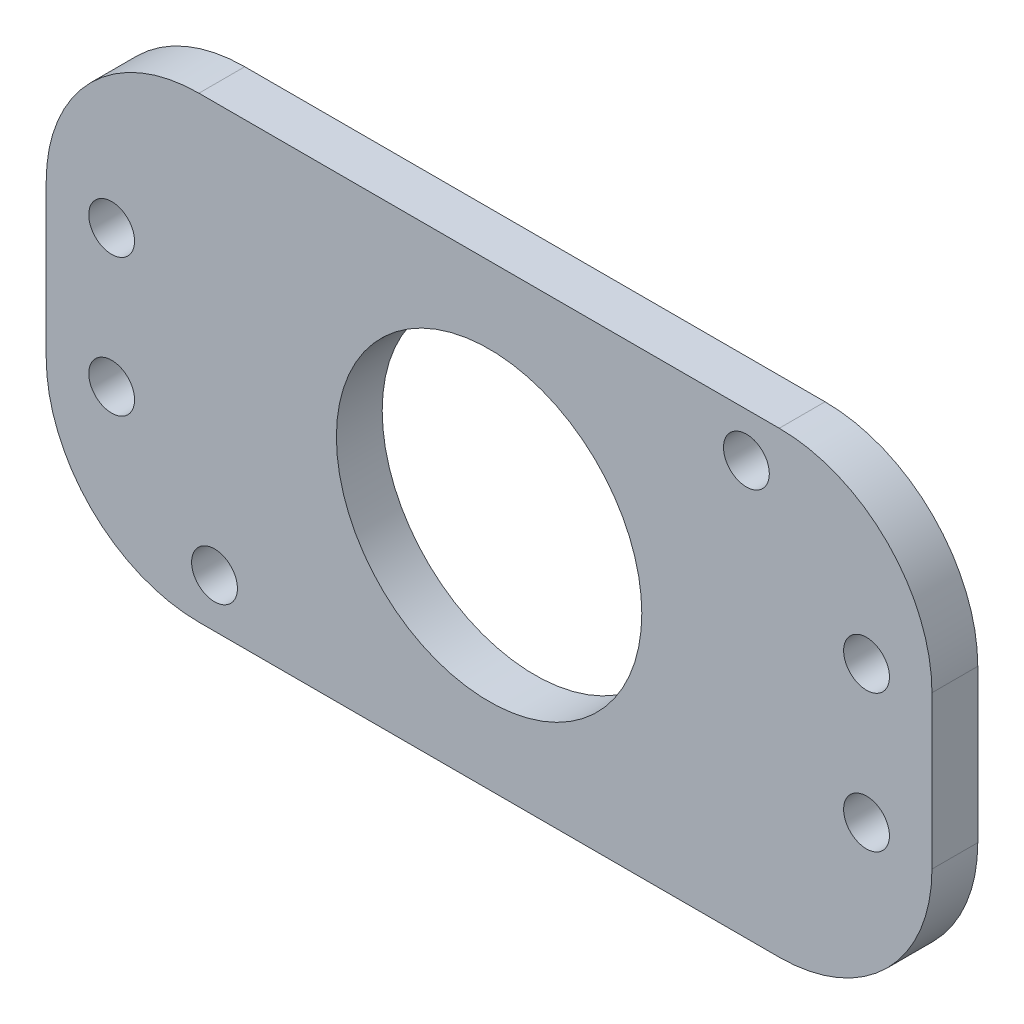
ISO-10303-21;
HEADER;
FILE_DESCRIPTION(('STEP AP214'),'2;1');
FILE_NAME('part.step','',(''),(''),'','','');
FILE_SCHEMA(('AUTOMOTIVE_DESIGN { 1 0 10303 214 1 1 1 1 }'));
ENDSEC;
DATA;
#1=APPLICATION_CONTEXT('core data for automotive mechanical design processes');
#2=APPLICATION_PROTOCOL_DEFINITION('international standard','automotive_design',2000,#1);
#3=PRODUCT_CONTEXT('',#1,'mechanical');
#4=PRODUCT('Part','Part','',(#3));
#5=PRODUCT_RELATED_PRODUCT_CATEGORY('part','',(#4));
#6=PRODUCT_DEFINITION_FORMATION('','',#4);
#7=PRODUCT_DEFINITION_CONTEXT('part definition',#1,'design');
#8=PRODUCT_DEFINITION('design','',#6,#7);
#9=PRODUCT_DEFINITION_SHAPE('','',#8);
#10=(LENGTH_UNIT() NAMED_UNIT(*) SI_UNIT(.MILLI.,.METRE.));
#11=(NAMED_UNIT(*) PLANE_ANGLE_UNIT() SI_UNIT($,.RADIAN.));
#12=(NAMED_UNIT(*) SI_UNIT($,.STERADIAN.) SOLID_ANGLE_UNIT());
#13=UNCERTAINTY_MEASURE_WITH_UNIT(LENGTH_MEASURE(1.E-05),#10,'distance_accuracy_value','');
#14=(GEOMETRIC_REPRESENTATION_CONTEXT(3) GLOBAL_UNCERTAINTY_ASSIGNED_CONTEXT((#13)) GLOBAL_UNIT_ASSIGNED_CONTEXT((#10,
#11,#12)) REPRESENTATION_CONTEXT('',''));
#15=CARTESIAN_POINT('',(0.,0.,0.));
#16=DIRECTION('',(0.,0.,1.));
#17=DIRECTION('',(1.,0.,0.));
#18=AXIS2_PLACEMENT_3D('',#15,#16,#17);
#19=CARTESIAN_POINT('',(21.6541911792369,17.1020808428069,3.));
#20=DIRECTION('',(-1.,0.,0.));
#21=DIRECTION('',(0.,0.,1.));
#22=AXIS2_PLACEMENT_3D('',#19,#20,#21);
#23=PLANE('',#22);
#24=DIRECTION('',(0.,1.,0.));
#25=VECTOR('',#24,1.);
#26=CARTESIAN_POINT('',(21.6541911792369,17.1020808428069,0.));
#27=LINE('',#26,#25);
#28=CARTESIAN_POINT('',(21.6541911792369,27.1020808428069,0.));
#29=VERTEX_POINT('',#28);
#30=CARTESIAN_POINT('',(21.6541911792369,37.1020808428069,0.));
#31=VERTEX_POINT('',#30);
#32=EDGE_CURVE('E135',#29,#31,#27,.T.);
#33=ORIENTED_EDGE('',*,*,#32,.T.);
#34=DIRECTION('',(0.,0.,-1.));
#35=VECTOR('',#34,1.);
#36=CARTESIAN_POINT('',(21.6541911792369,37.1020808428069,3.));
#37=LINE('',#36,#35);
#38=CARTESIAN_POINT('',(21.6541911792369,37.1020808428069,3.));
#39=VERTEX_POINT('',#38);
#40=EDGE_CURVE('E112',#31,#39,#37,.F.);
#41=ORIENTED_EDGE('',*,*,#40,.T.);
#42=DIRECTION('',(0.,1.,0.));
#43=VECTOR('',#42,1.);
#44=CARTESIAN_POINT('',(21.6541911792369,17.1020808428069,3.));
#45=LINE('',#44,#43);
#46=CARTESIAN_POINT('',(21.6541911792369,27.1020808428069,3.));
#47=VERTEX_POINT('',#46);
#48=EDGE_CURVE('E145',#47,#39,#45,.T.);
#49=ORIENTED_EDGE('',*,*,#48,.F.);
#50=DIRECTION('',(0.,0.,-1.));
#51=VECTOR('',#50,1.);
#52=CARTESIAN_POINT('',(21.6541911792369,27.1020808428069,3.));
#53=LINE('',#52,#51);
#54=EDGE_CURVE('E117',#47,#29,#53,.T.);
#55=ORIENTED_EDGE('',*,*,#54,.T.);
#56=EDGE_LOOP('',(#33,#41,#49,#55));
#57=FACE_BOUND('',#56,.T.);
#58=ADVANCED_FACE('F39',(#57),#23,.F.);
#59=CARTESIAN_POINT('',(-36.3458088207631,47.1020808428069,3.));
#60=DIRECTION('',(0.,-1.,0.));
#61=DIRECTION('',(0.,0.,-1.));
#62=AXIS2_PLACEMENT_3D('',#59,#60,#61);
#63=PLANE('',#62);
#64=DIRECTION('',(-1.,0.,0.));
#65=VECTOR('',#64,1.);
#66=CARTESIAN_POINT('',(-36.3458088207631,47.1020808428069,3.));
#67=LINE('',#66,#65);
#68=CARTESIAN_POINT('',(11.6541911792369,47.1020808428069,3.));
#69=VERTEX_POINT('',#68);
#70=CARTESIAN_POINT('',(-26.3458088207631,47.1020808428069,3.));
#71=VERTEX_POINT('',#70);
#72=EDGE_CURVE('E127',#69,#71,#67,.T.);
#73=ORIENTED_EDGE('',*,*,#72,.F.);
#74=DIRECTION('',(0.,0.,-1.));
#75=VECTOR('',#74,1.);
#76=CARTESIAN_POINT('',(11.6541911792369,47.1020808428069,3.));
#77=LINE('',#76,#75);
#78=CARTESIAN_POINT('',(11.6541911792369,47.1020808428069,0.));
#79=VERTEX_POINT('',#78);
#80=EDGE_CURVE('E111',#69,#79,#77,.T.);
#81=ORIENTED_EDGE('',*,*,#80,.T.);
#82=DIRECTION('',(-1.,0.,0.));
#83=VECTOR('',#82,1.);
#84=CARTESIAN_POINT('',(-36.3458088207631,47.1020808428069,0.));
#85=LINE('',#84,#83);
#86=CARTESIAN_POINT('',(-26.3458088207631,47.1020808428069,0.));
#87=VERTEX_POINT('',#86);
#88=EDGE_CURVE('E124',#79,#87,#85,.T.);
#89=ORIENTED_EDGE('',*,*,#88,.T.);
#90=DIRECTION('',(0.,0.,-1.));
#91=VECTOR('',#90,1.);
#92=CARTESIAN_POINT('',(-26.3458088207631,47.1020808428069,3.));
#93=LINE('',#92,#91);
#94=EDGE_CURVE('E129',#87,#71,#93,.F.);
#95=ORIENTED_EDGE('',*,*,#94,.T.);
#96=EDGE_LOOP('',(#73,#81,#89,#95));
#97=FACE_BOUND('',#96,.T.);
#98=ADVANCED_FACE('F123',(#97),#63,.F.);
#99=CARTESIAN_POINT('',(-36.3458088207631,17.1020808428069,3.));
#100=DIRECTION('',(1.,0.,0.));
#101=DIRECTION('',(0.,0.,-1.));
#102=AXIS2_PLACEMENT_3D('',#99,#100,#101);
#103=PLANE('',#102);
#104=DIRECTION('',(0.,-1.,0.));
#105=VECTOR('',#104,1.);
#106=CARTESIAN_POINT('',(-36.3458088207631,17.1020808428069,3.));
#107=LINE('',#106,#105);
#108=CARTESIAN_POINT('',(-36.3458088207631,37.1020808428069,3.));
#109=VERTEX_POINT('',#108);
#110=CARTESIAN_POINT('',(-36.3458088207631,27.1020808428069,3.));
#111=VERTEX_POINT('',#110);
#112=EDGE_CURVE('E169',#109,#111,#107,.T.);
#113=ORIENTED_EDGE('',*,*,#112,.F.);
#114=DIRECTION('',(0.,0.,-1.));
#115=VECTOR('',#114,1.);
#116=CARTESIAN_POINT('',(-36.3458088207631,37.1020808428069,3.));
#117=LINE('',#116,#115);
#118=CARTESIAN_POINT('',(-36.3458088207631,37.1020808428069,0.));
#119=VERTEX_POINT('',#118);
#120=EDGE_CURVE('E11',#109,#119,#117,.T.);
#121=ORIENTED_EDGE('',*,*,#120,.T.);
#122=DIRECTION('',(0.,-1.,0.));
#123=VECTOR('',#122,1.);
#124=CARTESIAN_POINT('',(-36.3458088207631,17.1020808428069,0.));
#125=LINE('',#124,#123);
#126=CARTESIAN_POINT('',(-36.3458088207631,27.1020808428069,0.));
#127=VERTEX_POINT('',#126);
#128=EDGE_CURVE('E134',#119,#127,#125,.T.);
#129=ORIENTED_EDGE('',*,*,#128,.T.);
#130=DIRECTION('',(0.,0.,-1.));
#131=VECTOR('',#130,1.);
#132=CARTESIAN_POINT('',(-36.3458088207631,27.1020808428069,3.));
#133=LINE('',#132,#131);
#134=EDGE_CURVE('E48',#127,#111,#133,.F.);
#135=ORIENTED_EDGE('',*,*,#134,.T.);
#136=EDGE_LOOP('',(#113,#121,#129,#135));
#137=FACE_BOUND('',#136,.T.);
#138=ADVANCED_FACE('F168',(#137),#103,.F.);
#139=CARTESIAN_POINT('',(-36.3458088207631,17.1020808428069,3.));
#140=DIRECTION('',(0.,1.,0.));
#141=DIRECTION('',(0.,0.,1.));
#142=AXIS2_PLACEMENT_3D('',#139,#140,#141);
#143=PLANE('',#142);
#144=DIRECTION('',(1.,0.,0.));
#145=VECTOR('',#144,1.);
#146=CARTESIAN_POINT('',(-36.3458088207631,17.1020808428069,0.));
#147=LINE('',#146,#145);
#148=CARTESIAN_POINT('',(-26.3458088207631,17.1020808428069,0.));
#149=VERTEX_POINT('',#148);
#150=CARTESIAN_POINT('',(11.6541911792369,17.1020808428069,0.));
#151=VERTEX_POINT('',#150);
#152=EDGE_CURVE('E138',#149,#151,#147,.T.);
#153=ORIENTED_EDGE('',*,*,#152,.T.);
#154=DIRECTION('',(0.,0.,-1.));
#155=VECTOR('',#154,1.);
#156=CARTESIAN_POINT('',(11.6541911792369,17.1020808428069,3.));
#157=LINE('',#156,#155);
#158=CARTESIAN_POINT('',(11.6541911792369,17.1020808428069,3.));
#159=VERTEX_POINT('',#158);
#160=EDGE_CURVE('E55',#151,#159,#157,.F.);
#161=ORIENTED_EDGE('',*,*,#160,.T.);
#162=DIRECTION('',(1.,0.,0.));
#163=VECTOR('',#162,1.);
#164=CARTESIAN_POINT('',(-36.3458088207631,17.1020808428069,3.));
#165=LINE('',#164,#163);
#166=CARTESIAN_POINT('',(-26.3458088207631,17.1020808428069,3.));
#167=VERTEX_POINT('',#166);
#168=EDGE_CURVE('E146',#167,#159,#165,.T.);
#169=ORIENTED_EDGE('',*,*,#168,.F.);
#170=DIRECTION('',(0.,0.,-1.));
#171=VECTOR('',#170,1.);
#172=CARTESIAN_POINT('',(-26.3458088207631,17.1020808428069,3.));
#173=LINE('',#172,#171);
#174=EDGE_CURVE('E161',#167,#149,#173,.T.);
#175=ORIENTED_EDGE('',*,*,#174,.T.);
#176=EDGE_LOOP('',(#153,#161,#169,#175));
#177=FACE_BOUND('',#176,.T.);
#178=ADVANCED_FACE('F178',(#177),#143,.F.);
#179=CARTESIAN_POINT('',(0.,0.,3.));
#180=DIRECTION('',(0.,0.,-1.));
#181=DIRECTION('',(-1.,0.,0.));
#182=AXIS2_PLACEMENT_3D('',#179,#180,#181);
#183=PLANE('',#182);
#184=CARTESIAN_POINT('',(-7.34580882076308,32.1020808428069,3.));
#185=DIRECTION('',(0.,0.,1.));
#186=DIRECTION('',(1.,0.,0.));
#187=AXIS2_PLACEMENT_3D('',#184,#185,#186);
#188=CIRCLE('',#187,10.);
#189=CARTESIAN_POINT('',(2.65419117923692,32.1020808428069,3.));
#190=VERTEX_POINT('',#189);
#191=EDGE_CURVE('E223',#190,#190,#188,.T.);
#192=ORIENTED_EDGE('',*,*,#191,.F.);
#193=EDGE_LOOP('',(#192));
#194=FACE_BOUND('',#193,.T.);
#195=CARTESIAN_POINT('',(-25.326377840613,20.2716955604362,3.));
#196=DIRECTION('',(0.,0.,1.));
#197=DIRECTION('',(1.,0.,0.));
#198=AXIS2_PLACEMENT_3D('',#195,#196,#197);
#199=CIRCLE('',#198,1.5);
#200=CARTESIAN_POINT('',(-23.8263778406129,20.2716955604362,3.));
#201=VERTEX_POINT('',#200);
#202=EDGE_CURVE('E218',#201,#201,#199,.T.);
#203=ORIENTED_EDGE('',*,*,#202,.F.);
#204=EDGE_LOOP('',(#203));
#205=FACE_BOUND('',#204,.T.);
#206=CARTESIAN_POINT('',(9.50347292286186,44.1944429146364,3.));
#207=DIRECTION('',(0.,0.,1.));
#208=DIRECTION('',(1.,0.,0.));
#209=AXIS2_PLACEMENT_3D('',#206,#207,#208);
#210=CIRCLE('',#209,1.5);
#211=CARTESIAN_POINT('',(11.0034729228619,44.1944429146364,3.));
#212=VERTEX_POINT('',#211);
#213=EDGE_CURVE('E215',#212,#212,#210,.T.);
#214=ORIENTED_EDGE('',*,*,#213,.F.);
#215=EDGE_LOOP('',(#214));
#216=FACE_BOUND('',#215,.T.);
#217=CARTESIAN_POINT('',(-32.0608088207631,27.6020808428069,3.));
#218=DIRECTION('',(0.,0.,-1.));
#219=DIRECTION('',(-1.,0.,0.));
#220=AXIS2_PLACEMENT_3D('',#217,#218,#219);
#221=CIRCLE('',#220,1.5);
#222=CARTESIAN_POINT('',(-33.5608088207631,27.6020808428069,3.));
#223=VERTEX_POINT('',#222);
#224=EDGE_CURVE('E207',#223,#223,#221,.T.);
#225=ORIENTED_EDGE('',*,*,#224,.T.);
#226=EDGE_LOOP('',(#225));
#227=FACE_BOUND('',#226,.T.);
#228=CARTESIAN_POINT('',(-32.0608088207631,36.6020808428069,3.));
#229=DIRECTION('',(0.,0.,-1.));
#230=DIRECTION('',(-1.,0.,0.));
#231=AXIS2_PLACEMENT_3D('',#228,#229,#230);
#232=CIRCLE('',#231,1.5);
#233=CARTESIAN_POINT('',(-33.5608088207631,36.6020808428069,3.));
#234=VERTEX_POINT('',#233);
#235=EDGE_CURVE('E200',#234,#234,#232,.T.);
#236=ORIENTED_EDGE('',*,*,#235,.T.);
#237=EDGE_LOOP('',(#236));
#238=FACE_BOUND('',#237,.T.);
#239=CARTESIAN_POINT('',(17.3691911792369,27.6020808428069,3.));
#240=DIRECTION('',(0.,0.,1.));
#241=DIRECTION('',(1.,0.,0.));
#242=AXIS2_PLACEMENT_3D('',#239,#240,#241);
#243=CIRCLE('',#242,1.5);
#244=CARTESIAN_POINT('',(18.8691911792369,27.6020808428069,3.));
#245=VERTEX_POINT('',#244);
#246=EDGE_CURVE('E195',#245,#245,#243,.T.);
#247=ORIENTED_EDGE('',*,*,#246,.F.);
#248=EDGE_LOOP('',(#247));
#249=FACE_BOUND('',#248,.T.);
#250=CARTESIAN_POINT('',(17.3691911792369,36.6020808428069,3.));
#251=DIRECTION('',(0.,0.,1.));
#252=DIRECTION('',(1.,0.,0.));
#253=AXIS2_PLACEMENT_3D('',#250,#251,#252);
#254=CIRCLE('',#253,1.5);
#255=CARTESIAN_POINT('',(18.8691911792369,36.6020808428069,3.));
#256=VERTEX_POINT('',#255);
#257=EDGE_CURVE('E191',#256,#256,#254,.T.);
#258=ORIENTED_EDGE('',*,*,#257,.F.);
#259=EDGE_LOOP('',(#258));
#260=FACE_BOUND('',#259,.T.);
#261=ORIENTED_EDGE('',*,*,#48,.T.);
#262=CARTESIAN_POINT('',(11.6541911792369,37.1020808428069,3.));
#263=DIRECTION('',(0.,0.,-1.));
#264=DIRECTION('',(-1.,0.,0.));
#265=AXIS2_PLACEMENT_3D('',#262,#263,#264);
#266=CIRCLE('',#265,10.);
#267=EDGE_CURVE('E159',#39,#69,#266,.F.);
#268=ORIENTED_EDGE('',*,*,#267,.T.);
#269=ORIENTED_EDGE('',*,*,#72,.T.);
#270=CARTESIAN_POINT('',(-26.3458088207631,37.1020808428069,3.));
#271=DIRECTION('',(0.,0.,-1.));
#272=DIRECTION('',(-1.,0.,0.));
#273=AXIS2_PLACEMENT_3D('',#270,#271,#272);
#274=CIRCLE('',#273,10.);
#275=EDGE_CURVE('E155',#71,#109,#274,.F.);
#276=ORIENTED_EDGE('',*,*,#275,.T.);
#277=ORIENTED_EDGE('',*,*,#112,.T.);
#278=CARTESIAN_POINT('',(-26.3458088207631,27.1020808428069,3.));
#279=DIRECTION('',(0.,0.,-1.));
#280=DIRECTION('',(-1.,0.,0.));
#281=AXIS2_PLACEMENT_3D('',#278,#279,#280);
#282=CIRCLE('',#281,10.);
#283=EDGE_CURVE('E62',#111,#167,#282,.F.);
#284=ORIENTED_EDGE('',*,*,#283,.T.);
#285=ORIENTED_EDGE('',*,*,#168,.T.);
#286=CARTESIAN_POINT('',(11.6541911792369,27.1020808428069,3.));
#287=DIRECTION('',(0.,0.,-1.));
#288=DIRECTION('',(-1.,0.,0.));
#289=AXIS2_PLACEMENT_3D('',#286,#287,#288);
#290=CIRCLE('',#289,10.);
#291=EDGE_CURVE('E157',#159,#47,#290,.F.);
#292=ORIENTED_EDGE('',*,*,#291,.T.);
#293=EDGE_LOOP('',(#261,#268,#269,#276,#277,#284,#285,#292));
#294=FACE_BOUND('',#293,.T.);
#295=ADVANCED_FACE('F173',(#194,#205,#216,#227,#238,#249,#260,#294),#183,.F.);
#296=CARTESIAN_POINT('',(0.,0.,0.));
#297=DIRECTION('',(0.,0.,-1.));
#298=DIRECTION('',(-1.,0.,0.));
#299=AXIS2_PLACEMENT_3D('',#296,#297,#298);
#300=PLANE('',#299);
#301=CARTESIAN_POINT('',(-7.34580882076308,32.1020808428069,0.));
#302=DIRECTION('',(0.,0.,-1.));
#303=DIRECTION('',(-1.,0.,0.));
#304=AXIS2_PLACEMENT_3D('',#301,#302,#303);
#305=CIRCLE('',#304,10.);
#306=CARTESIAN_POINT('',(-17.3458088207631,32.1020808428069,0.));
#307=VERTEX_POINT('',#306);
#308=EDGE_CURVE('E43',#307,#307,#305,.T.);
#309=ORIENTED_EDGE('',*,*,#308,.F.);
#310=EDGE_LOOP('',(#309));
#311=FACE_BOUND('',#310,.T.);
#312=CARTESIAN_POINT('',(-25.326377840613,20.2716955604362,0.));
#313=DIRECTION('',(0.,0.,1.));
#314=DIRECTION('',(1.,0.,0.));
#315=AXIS2_PLACEMENT_3D('',#312,#313,#314);
#316=CIRCLE('',#315,1.5);
#317=CARTESIAN_POINT('',(-23.8263778406129,20.2716955604362,0.));
#318=VERTEX_POINT('',#317);
#319=EDGE_CURVE('E204',#318,#318,#316,.T.);
#320=ORIENTED_EDGE('',*,*,#319,.T.);
#321=EDGE_LOOP('',(#320));
#322=FACE_BOUND('',#321,.T.);
#323=CARTESIAN_POINT('',(9.50347292286186,44.1944429146364,0.));
#324=DIRECTION('',(0.,0.,1.));
#325=DIRECTION('',(1.,0.,0.));
#326=AXIS2_PLACEMENT_3D('',#323,#324,#325);
#327=CIRCLE('',#326,1.5);
#328=CARTESIAN_POINT('',(11.0034729228619,44.1944429146364,0.));
#329=VERTEX_POINT('',#328);
#330=EDGE_CURVE('E212',#329,#329,#327,.T.);
#331=ORIENTED_EDGE('',*,*,#330,.T.);
#332=EDGE_LOOP('',(#331));
#333=FACE_BOUND('',#332,.T.);
#334=CARTESIAN_POINT('',(-32.0608088207631,27.6020808428069,0.));
#335=DIRECTION('',(0.,0.,-1.));
#336=DIRECTION('',(-1.,0.,0.));
#337=AXIS2_PLACEMENT_3D('',#334,#335,#336);
#338=CIRCLE('',#337,1.5);
#339=CARTESIAN_POINT('',(-33.5608088207631,27.6020808428069,0.));
#340=VERTEX_POINT('',#339);
#341=EDGE_CURVE('E192',#340,#340,#338,.T.);
#342=ORIENTED_EDGE('',*,*,#341,.F.);
#343=EDGE_LOOP('',(#342));
#344=FACE_BOUND('',#343,.T.);
#345=CARTESIAN_POINT('',(-32.0608088207631,36.6020808428069,0.));
#346=DIRECTION('',(0.,0.,-1.));
#347=DIRECTION('',(-1.,0.,0.));
#348=AXIS2_PLACEMENT_3D('',#345,#346,#347);
#349=CIRCLE('',#348,1.5);
#350=CARTESIAN_POINT('',(-33.5608088207631,36.6020808428069,0.));
#351=VERTEX_POINT('',#350);
#352=EDGE_CURVE('E203',#351,#351,#349,.T.);
#353=ORIENTED_EDGE('',*,*,#352,.F.);
#354=EDGE_LOOP('',(#353));
#355=FACE_BOUND('',#354,.T.);
#356=CARTESIAN_POINT('',(17.3691911792369,27.6020808428069,0.));
#357=DIRECTION('',(0.,0.,1.));
#358=DIRECTION('',(1.,0.,0.));
#359=AXIS2_PLACEMENT_3D('',#356,#357,#358);
#360=CIRCLE('',#359,1.5);
#361=CARTESIAN_POINT('',(18.8691911792369,27.6020808428069,0.));
#362=VERTEX_POINT('',#361);
#363=EDGE_CURVE('E140',#362,#362,#360,.T.);
#364=ORIENTED_EDGE('',*,*,#363,.T.);
#365=EDGE_LOOP('',(#364));
#366=FACE_BOUND('',#365,.T.);
#367=CARTESIAN_POINT('',(17.3691911792369,36.6020808428069,0.));
#368=DIRECTION('',(0.,0.,1.));
#369=DIRECTION('',(1.,0.,0.));
#370=AXIS2_PLACEMENT_3D('',#367,#368,#369);
#371=CIRCLE('',#370,1.5);
#372=CARTESIAN_POINT('',(18.8691911792369,36.6020808428069,0.));
#373=VERTEX_POINT('',#372);
#374=EDGE_CURVE('E188',#373,#373,#371,.T.);
#375=ORIENTED_EDGE('',*,*,#374,.T.);
#376=EDGE_LOOP('',(#375));
#377=FACE_BOUND('',#376,.T.);
#378=ORIENTED_EDGE('',*,*,#88,.F.);
#379=CARTESIAN_POINT('',(11.6541911792369,37.1020808428069,0.));
#380=DIRECTION('',(0.,0.,-1.));
#381=DIRECTION('',(-1.,0.,0.));
#382=AXIS2_PLACEMENT_3D('',#379,#380,#381);
#383=CIRCLE('',#382,10.);
#384=EDGE_CURVE('E107',#79,#31,#383,.T.);
#385=ORIENTED_EDGE('',*,*,#384,.T.);
#386=ORIENTED_EDGE('',*,*,#32,.F.);
#387=CARTESIAN_POINT('',(11.6541911792369,27.1020808428069,0.));
#388=DIRECTION('',(0.,0.,-1.));
#389=DIRECTION('',(-1.,0.,0.));
#390=AXIS2_PLACEMENT_3D('',#387,#388,#389);
#391=CIRCLE('',#390,10.);
#392=EDGE_CURVE('E118',#29,#151,#391,.T.);
#393=ORIENTED_EDGE('',*,*,#392,.T.);
#394=ORIENTED_EDGE('',*,*,#152,.F.);
#395=CARTESIAN_POINT('',(-26.3458088207631,27.1020808428069,0.));
#396=DIRECTION('',(0.,0.,-1.));
#397=DIRECTION('',(-1.,0.,0.));
#398=AXIS2_PLACEMENT_3D('',#395,#396,#397);
#399=CIRCLE('',#398,10.);
#400=EDGE_CURVE('E128',#149,#127,#399,.T.);
#401=ORIENTED_EDGE('',*,*,#400,.T.);
#402=ORIENTED_EDGE('',*,*,#128,.F.);
#403=CARTESIAN_POINT('',(-26.3458088207631,37.1020808428069,0.));
#404=DIRECTION('',(0.,0.,-1.));
#405=DIRECTION('',(-1.,0.,0.));
#406=AXIS2_PLACEMENT_3D('',#403,#404,#405);
#407=CIRCLE('',#406,10.);
#408=EDGE_CURVE('E133',#119,#87,#407,.T.);
#409=ORIENTED_EDGE('',*,*,#408,.T.);
#410=EDGE_LOOP('',(#378,#385,#386,#393,#394,#401,#402,#409));
#411=FACE_BOUND('',#410,.T.);
#412=ADVANCED_FACE('F131',(#311,#322,#333,#344,#355,#366,#377,#411),#300,.T.);
#413=CARTESIAN_POINT('',(11.6541911792369,37.1020808428069,3.));
#414=DIRECTION('',(0.,0.,-1.));
#415=DIRECTION('',(-1.,0.,0.));
#416=AXIS2_PLACEMENT_3D('',#413,#414,#415);
#417=CYLINDRICAL_SURFACE('',#416,10.);
#418=ORIENTED_EDGE('',*,*,#267,.F.);
#419=ORIENTED_EDGE('',*,*,#40,.F.);
#420=ORIENTED_EDGE('',*,*,#384,.F.);
#421=ORIENTED_EDGE('',*,*,#80,.F.);
#422=EDGE_LOOP('',(#418,#419,#420,#421));
#423=FACE_BOUND('',#422,.T.);
#424=ADVANCED_FACE('F110',(#423),#417,.T.);
#425=CARTESIAN_POINT('',(11.6541911792369,27.1020808428069,3.));
#426=DIRECTION('',(0.,0.,-1.));
#427=DIRECTION('',(-1.,0.,0.));
#428=AXIS2_PLACEMENT_3D('',#425,#426,#427);
#429=CYLINDRICAL_SURFACE('',#428,10.);
#430=ORIENTED_EDGE('',*,*,#291,.F.);
#431=ORIENTED_EDGE('',*,*,#160,.F.);
#432=ORIENTED_EDGE('',*,*,#392,.F.);
#433=ORIENTED_EDGE('',*,*,#54,.F.);
#434=EDGE_LOOP('',(#430,#431,#432,#433));
#435=FACE_BOUND('',#434,.T.);
#436=ADVANCED_FACE('F182',(#435),#429,.T.);
#437=CARTESIAN_POINT('',(-26.3458088207631,37.1020808428069,3.));
#438=DIRECTION('',(0.,0.,-1.));
#439=DIRECTION('',(-1.,0.,0.));
#440=AXIS2_PLACEMENT_3D('',#437,#438,#439);
#441=CYLINDRICAL_SURFACE('',#440,10.);
#442=ORIENTED_EDGE('',*,*,#275,.F.);
#443=ORIENTED_EDGE('',*,*,#94,.F.);
#444=ORIENTED_EDGE('',*,*,#408,.F.);
#445=ORIENTED_EDGE('',*,*,#120,.F.);
#446=EDGE_LOOP('',(#442,#443,#444,#445));
#447=FACE_BOUND('',#446,.T.);
#448=ADVANCED_FACE('F274',(#447),#441,.T.);
#449=CARTESIAN_POINT('',(-26.3458088207631,27.1020808428069,3.));
#450=DIRECTION('',(0.,0.,-1.));
#451=DIRECTION('',(-1.,0.,0.));
#452=AXIS2_PLACEMENT_3D('',#449,#450,#451);
#453=CYLINDRICAL_SURFACE('',#452,10.);
#454=ORIENTED_EDGE('',*,*,#283,.F.);
#455=ORIENTED_EDGE('',*,*,#134,.F.);
#456=ORIENTED_EDGE('',*,*,#400,.F.);
#457=ORIENTED_EDGE('',*,*,#174,.F.);
#458=EDGE_LOOP('',(#454,#455,#456,#457));
#459=FACE_BOUND('',#458,.T.);
#460=ADVANCED_FACE('F41',(#459),#453,.T.);
#461=CARTESIAN_POINT('',(17.3691911792369,36.6020808428069,0.));
#462=DIRECTION('',(0.,0.,1.));
#463=DIRECTION('',(1.,0.,0.));
#464=AXIS2_PLACEMENT_3D('',#461,#462,#463);
#465=CYLINDRICAL_SURFACE('',#464,1.5);
#466=ORIENTED_EDGE('',*,*,#374,.F.);
#467=EDGE_LOOP('',(#466));
#468=FACE_BOUND('',#467,.T.);
#469=ORIENTED_EDGE('',*,*,#257,.T.);
#470=EDGE_LOOP('',(#469));
#471=FACE_BOUND('',#470,.T.);
#472=ADVANCED_FACE('F247',(#468,#471),#465,.F.);
#473=CARTESIAN_POINT('',(17.3691911792369,27.6020808428069,0.));
#474=DIRECTION('',(0.,0.,1.));
#475=DIRECTION('',(1.,0.,0.));
#476=AXIS2_PLACEMENT_3D('',#473,#474,#475);
#477=CYLINDRICAL_SURFACE('',#476,1.5);
#478=ORIENTED_EDGE('',*,*,#363,.F.);
#479=EDGE_LOOP('',(#478));
#480=FACE_BOUND('',#479,.T.);
#481=ORIENTED_EDGE('',*,*,#246,.T.);
#482=EDGE_LOOP('',(#481));
#483=FACE_BOUND('',#482,.T.);
#484=ADVANCED_FACE('F250',(#480,#483),#477,.F.);
#485=CARTESIAN_POINT('',(-32.0608088207631,36.6020808428069,0.));
#486=DIRECTION('',(0.,0.,1.));
#487=DIRECTION('',(1.,0.,0.));
#488=AXIS2_PLACEMENT_3D('',#485,#486,#487);
#489=CYLINDRICAL_SURFACE('',#488,1.5);
#490=ORIENTED_EDGE('',*,*,#352,.T.);
#491=EDGE_LOOP('',(#490));
#492=FACE_BOUND('',#491,.T.);
#493=ORIENTED_EDGE('',*,*,#235,.F.);
#494=EDGE_LOOP('',(#493));
#495=FACE_BOUND('',#494,.T.);
#496=ADVANCED_FACE('F294',(#492,#495),#489,.F.);
#497=CARTESIAN_POINT('',(-32.0608088207631,27.6020808428069,0.));
#498=DIRECTION('',(0.,0.,1.));
#499=DIRECTION('',(1.,0.,0.));
#500=AXIS2_PLACEMENT_3D('',#497,#498,#499);
#501=CYLINDRICAL_SURFACE('',#500,1.5);
#502=ORIENTED_EDGE('',*,*,#341,.T.);
#503=EDGE_LOOP('',(#502));
#504=FACE_BOUND('',#503,.T.);
#505=ORIENTED_EDGE('',*,*,#224,.F.);
#506=EDGE_LOOP('',(#505));
#507=FACE_BOUND('',#506,.T.);
#508=ADVANCED_FACE('F303',(#504,#507),#501,.F.);
#509=CARTESIAN_POINT('',(9.50347292286186,44.1944429146364,0.));
#510=DIRECTION('',(0.,0.,1.));
#511=DIRECTION('',(1.,0.,0.));
#512=AXIS2_PLACEMENT_3D('',#509,#510,#511);
#513=CYLINDRICAL_SURFACE('',#512,1.5);
#514=ORIENTED_EDGE('',*,*,#330,.F.);
#515=EDGE_LOOP('',(#514));
#516=FACE_BOUND('',#515,.T.);
#517=ORIENTED_EDGE('',*,*,#213,.T.);
#518=EDGE_LOOP('',(#517));
#519=FACE_BOUND('',#518,.T.);
#520=ADVANCED_FACE('F312',(#516,#519),#513,.F.);
#521=CARTESIAN_POINT('',(-25.326377840613,20.2716955604362,0.));
#522=DIRECTION('',(0.,0.,1.));
#523=DIRECTION('',(1.,0.,0.));
#524=AXIS2_PLACEMENT_3D('',#521,#522,#523);
#525=CYLINDRICAL_SURFACE('',#524,1.5);
#526=ORIENTED_EDGE('',*,*,#319,.F.);
#527=EDGE_LOOP('',(#526));
#528=FACE_BOUND('',#527,.T.);
#529=ORIENTED_EDGE('',*,*,#202,.T.);
#530=EDGE_LOOP('',(#529));
#531=FACE_BOUND('',#530,.T.);
#532=ADVANCED_FACE('F320',(#528,#531),#525,.F.);
#533=CARTESIAN_POINT('',(-7.34580882076308,32.1020808428069,-7.));
#534=DIRECTION('',(0.,0.,1.));
#535=DIRECTION('',(1.,0.,0.));
#536=AXIS2_PLACEMENT_3D('',#533,#534,#535);
#537=CYLINDRICAL_SURFACE('',#536,10.);
#538=ORIENTED_EDGE('',*,*,#308,.T.);
#539=EDGE_LOOP('',(#538));
#540=FACE_BOUND('',#539,.T.);
#541=ORIENTED_EDGE('',*,*,#191,.T.);
#542=EDGE_LOOP('',(#541));
#543=FACE_BOUND('',#542,.T.);
#544=ADVANCED_FACE('F230',(#540,#543),#537,.F.);
#545=CLOSED_SHELL('',(#58,#98,#138,#178,#295,#412,#424,#436,#448,#460,#472,#484,#496,#508,#520,
#532,#544));
#546=MANIFOLD_SOLID_BREP('B2',#545);
#547=ADVANCED_BREP_SHAPE_REPRESENTATION('',(#18,#546),#14);
#548=SHAPE_DEFINITION_REPRESENTATION(#9,#547);
ENDSEC;
END-ISO-10303-21;
